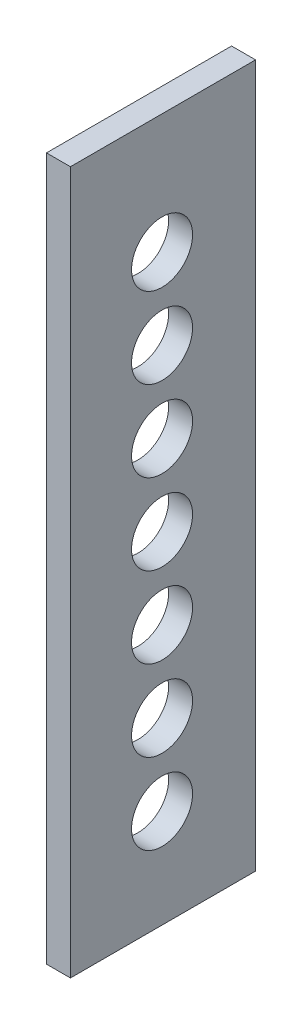
ISO-10303-21;
HEADER;
FILE_DESCRIPTION(('STEP AP214'),'2;1');
FILE_NAME('part.step','',(''),(''),'','','');
FILE_SCHEMA(('AUTOMOTIVE_DESIGN { 1 0 10303 214 1 1 1 1 }'));
ENDSEC;
DATA;
#1=APPLICATION_CONTEXT('core data for automotive mechanical design processes');
#2=APPLICATION_PROTOCOL_DEFINITION('international standard','automotive_design',2000,#1);
#3=PRODUCT_CONTEXT('',#1,'mechanical');
#4=PRODUCT('Part','Part','',(#3));
#5=PRODUCT_RELATED_PRODUCT_CATEGORY('part','',(#4));
#6=PRODUCT_DEFINITION_FORMATION('','',#4);
#7=PRODUCT_DEFINITION_CONTEXT('part definition',#1,'design');
#8=PRODUCT_DEFINITION('design','',#6,#7);
#9=PRODUCT_DEFINITION_SHAPE('','',#8);
#10=(LENGTH_UNIT() NAMED_UNIT(*) SI_UNIT(.MILLI.,.METRE.));
#11=(NAMED_UNIT(*) PLANE_ANGLE_UNIT() SI_UNIT($,.RADIAN.));
#12=(NAMED_UNIT(*) SI_UNIT($,.STERADIAN.) SOLID_ANGLE_UNIT());
#13=UNCERTAINTY_MEASURE_WITH_UNIT(LENGTH_MEASURE(1.E-05),#10,'distance_accuracy_value','');
#14=(GEOMETRIC_REPRESENTATION_CONTEXT(3) GLOBAL_UNCERTAINTY_ASSIGNED_CONTEXT((#13)) GLOBAL_UNIT_ASSIGNED_CONTEXT((#10,
#11,#12)) REPRESENTATION_CONTEXT('',''));
#15=CARTESIAN_POINT('',(0.,0.,0.));
#16=DIRECTION('',(0.,0.,1.));
#17=DIRECTION('',(1.,0.,0.));
#18=AXIS2_PLACEMENT_3D('',#15,#16,#17);
#19=CARTESIAN_POINT('',(5.5,-161.164904788649,-8.64690263835399E-11));
#20=DIRECTION('',(1.,0.,0.));
#21=DIRECTION('',(0.,0.,-1.));
#22=AXIS2_PLACEMENT_3D('',#19,#20,#21);
#23=PLANE('',#22);
#24=CARTESIAN_POINT('',(5.5,-120.033955517333,-21.0159809053521));
#25=DIRECTION('',(1.,0.,0.));
#26=DIRECTION('',(0.,0.,-1.));
#27=AXIS2_PLACEMENT_3D('',#24,#25,#26);
#28=CIRCLE('',#27,7.);
#29=CARTESIAN_POINT('',(5.5,-120.033955517333,-28.0159809053521));
#30=VERTEX_POINT('',#29);
#31=EDGE_CURVE('E137',#30,#30,#28,.T.);
#32=ORIENTED_EDGE('',*,*,#31,.F.);
#33=EDGE_LOOP('',(#32));
#34=FACE_BOUND('',#33,.T.);
#35=CARTESIAN_POINT('',(5.5,-83.0076355725733,-21.0159809053517));
#36=DIRECTION('',(1.,0.,0.));
#37=DIRECTION('',(0.,0.,-1.));
#38=AXIS2_PLACEMENT_3D('',#35,#36,#37);
#39=CIRCLE('',#38,7.);
#40=CARTESIAN_POINT('',(5.5,-83.0076355725733,-28.0159809053517));
#41=VERTEX_POINT('',#40);
#42=EDGE_CURVE('E125',#41,#41,#39,.T.);
#43=ORIENTED_EDGE('',*,*,#42,.F.);
#44=EDGE_LOOP('',(#43));
#45=FACE_BOUND('',#44,.T.);
#46=CARTESIAN_POINT('',(5.5,-45.9813156278136,-21.0159809053513));
#47=DIRECTION('',(1.,0.,0.));
#48=DIRECTION('',(0.,0.,-1.));
#49=AXIS2_PLACEMENT_3D('',#46,#47,#48);
#50=CIRCLE('',#49,7.);
#51=CARTESIAN_POINT('',(5.5,-45.9813156278136,-28.0159809053513));
#52=VERTEX_POINT('',#51);
#53=EDGE_CURVE('E113',#52,#52,#50,.T.);
#54=ORIENTED_EDGE('',*,*,#53,.F.);
#55=EDGE_LOOP('',(#54));
#56=FACE_BOUND('',#55,.T.);
#57=DIRECTION('',(0.,-1.,0.));
#58=VECTOR('',#57,1.);
#59=CARTESIAN_POINT('',(5.5,0.,-8.64492893750615E-11));
#60=LINE('',#59,#58);
#61=CARTESIAN_POINT('',(5.5,0.,-8.64492893750615E-11));
#62=VERTEX_POINT('',#61);
#63=CARTESIAN_POINT('',(5.5,-161.164904788649,-8.64690263835399E-11));
#64=VERTEX_POINT('',#63);
#65=EDGE_CURVE('E83',#62,#64,#60,.T.);
#66=ORIENTED_EDGE('',*,*,#65,.T.);
#67=DIRECTION('',(0.,0.,-1.));
#68=VECTOR('',#67,1.);
#69=CARTESIAN_POINT('',(5.5,-161.164904788649,-8.64690263835399E-11));
#70=LINE('',#69,#68);
#71=CARTESIAN_POINT('',(5.5,-161.164904788649,-42.4617451466736));
#72=VERTEX_POINT('',#71);
#73=EDGE_CURVE('E78',#64,#72,#70,.T.);
#74=ORIENTED_EDGE('',*,*,#73,.T.);
#75=DIRECTION('',(0.,1.,0.));
#76=VECTOR('',#75,1.);
#77=CARTESIAN_POINT('',(5.5,0.,-42.4617451466735));
#78=LINE('',#77,#76);
#79=CARTESIAN_POINT('',(5.5,0.,-42.4617451466735));
#80=VERTEX_POINT('',#79);
#81=EDGE_CURVE('E81',#72,#80,#78,.T.);
#82=ORIENTED_EDGE('',*,*,#81,.T.);
#83=DIRECTION('',(0.,0.,1.));
#84=VECTOR('',#83,1.);
#85=CARTESIAN_POINT('',(5.5,0.,-8.64492893750615E-11));
#86=LINE('',#85,#84);
#87=EDGE_CURVE('E48',#80,#62,#86,.T.);
#88=ORIENTED_EDGE('',*,*,#87,.T.);
#89=EDGE_LOOP('',(#66,#74,#82,#88));
#90=FACE_BOUND('',#89,.T.);
#91=CARTESIAN_POINT('',(5.5,-27.4681556554338,-21.0159809053511));
#92=DIRECTION('',(1.,0.,0.));
#93=DIRECTION('',(0.,0.,-1.));
#94=AXIS2_PLACEMENT_3D('',#91,#92,#93);
#95=CIRCLE('',#94,7.);
#96=CARTESIAN_POINT('',(5.5,-27.4681556554338,-28.0159809053511));
#97=VERTEX_POINT('',#96);
#98=EDGE_CURVE('E98',#97,#97,#95,.T.);
#99=ORIENTED_EDGE('',*,*,#98,.F.);
#100=EDGE_LOOP('',(#99));
#101=FACE_BOUND('',#100,.T.);
#102=CARTESIAN_POINT('',(5.5,-64.4944756001935,-21.0159809053515));
#103=DIRECTION('',(1.,0.,0.));
#104=DIRECTION('',(0.,0.,-1.));
#105=AXIS2_PLACEMENT_3D('',#102,#103,#104);
#106=CIRCLE('',#105,7.);
#107=CARTESIAN_POINT('',(5.5,-64.4944756001935,-28.0159809053515));
#108=VERTEX_POINT('',#107);
#109=EDGE_CURVE('E119',#108,#108,#106,.T.);
#110=ORIENTED_EDGE('',*,*,#109,.F.);
#111=EDGE_LOOP('',(#110));
#112=FACE_BOUND('',#111,.T.);
#113=CARTESIAN_POINT('',(5.5,-101.520795544953,-21.0159809053519));
#114=DIRECTION('',(1.,0.,0.));
#115=DIRECTION('',(0.,0.,-1.));
#116=AXIS2_PLACEMENT_3D('',#113,#114,#115);
#117=CIRCLE('',#116,7.);
#118=CARTESIAN_POINT('',(5.5,-101.520795544953,-28.0159809053519));
#119=VERTEX_POINT('',#118);
#120=EDGE_CURVE('E131',#119,#119,#117,.T.);
#121=ORIENTED_EDGE('',*,*,#120,.F.);
#122=EDGE_LOOP('',(#121));
#123=FACE_BOUND('',#122,.T.);
#124=CARTESIAN_POINT('',(5.5,-138.547115489713,-21.0159809053523));
#125=DIRECTION('',(1.,0.,0.));
#126=DIRECTION('',(0.,0.,-1.));
#127=AXIS2_PLACEMENT_3D('',#124,#125,#126);
#128=CIRCLE('',#127,7.);
#129=CARTESIAN_POINT('',(5.5,-138.547115489713,-28.0159809053523));
#130=VERTEX_POINT('',#129);
#131=EDGE_CURVE('E143',#130,#130,#128,.T.);
#132=ORIENTED_EDGE('',*,*,#131,.F.);
#133=EDGE_LOOP('',(#132));
#134=FACE_BOUND('',#133,.T.);
#135=ADVANCED_FACE('F31',(#34,#45,#56,#90,#101,#112,#123,#134),#23,.T.);
#136=CARTESIAN_POINT('',(0.,-161.164904788649,-8.64690263835399E-11));
#137=DIRECTION('',(1.,0.,0.));
#138=DIRECTION('',(0.,0.,-1.));
#139=AXIS2_PLACEMENT_3D('',#136,#137,#138);
#140=PLANE('',#139);
#141=CARTESIAN_POINT('',(0.,-120.033955517333,-21.0159809053521));
#142=DIRECTION('',(1.,0.,0.));
#143=DIRECTION('',(0.,0.,-1.));
#144=AXIS2_PLACEMENT_3D('',#141,#142,#143);
#145=CIRCLE('',#144,7.);
#146=CARTESIAN_POINT('',(0.,-120.033955517333,-28.0159809053521));
#147=VERTEX_POINT('',#146);
#148=EDGE_CURVE('E140',#147,#147,#145,.T.);
#149=ORIENTED_EDGE('',*,*,#148,.T.);
#150=EDGE_LOOP('',(#149));
#151=FACE_BOUND('',#150,.T.);
#152=CARTESIAN_POINT('',(0.,-83.0076355725733,-21.0159809053517));
#153=DIRECTION('',(1.,0.,0.));
#154=DIRECTION('',(0.,0.,-1.));
#155=AXIS2_PLACEMENT_3D('',#152,#153,#154);
#156=CIRCLE('',#155,7.);
#157=CARTESIAN_POINT('',(0.,-83.0076355725733,-28.0159809053517));
#158=VERTEX_POINT('',#157);
#159=EDGE_CURVE('E128',#158,#158,#156,.T.);
#160=ORIENTED_EDGE('',*,*,#159,.T.);
#161=EDGE_LOOP('',(#160));
#162=FACE_BOUND('',#161,.T.);
#163=CARTESIAN_POINT('',(0.,-45.9813156278136,-21.0159809053513));
#164=DIRECTION('',(1.,0.,0.));
#165=DIRECTION('',(0.,0.,-1.));
#166=AXIS2_PLACEMENT_3D('',#163,#164,#165);
#167=CIRCLE('',#166,7.);
#168=CARTESIAN_POINT('',(0.,-45.9813156278136,-28.0159809053513));
#169=VERTEX_POINT('',#168);
#170=EDGE_CURVE('E116',#169,#169,#167,.T.);
#171=ORIENTED_EDGE('',*,*,#170,.T.);
#172=EDGE_LOOP('',(#171));
#173=FACE_BOUND('',#172,.T.);
#174=DIRECTION('',(0.,-1.,0.));
#175=VECTOR('',#174,1.);
#176=CARTESIAN_POINT('',(0.,0.,-8.64492893750615E-11));
#177=LINE('',#176,#175);
#178=CARTESIAN_POINT('',(0.,0.,-8.64492893750615E-11));
#179=VERTEX_POINT('',#178);
#180=CARTESIAN_POINT('',(0.,-161.164904788649,-8.64690263835399E-11));
#181=VERTEX_POINT('',#180);
#182=EDGE_CURVE('E95',#179,#181,#177,.T.);
#183=ORIENTED_EDGE('',*,*,#182,.F.);
#184=DIRECTION('',(0.,0.,1.));
#185=VECTOR('',#184,1.);
#186=CARTESIAN_POINT('',(0.,0.,-8.64492893750615E-11));
#187=LINE('',#186,#185);
#188=CARTESIAN_POINT('',(0.,0.,-42.4617451466735));
#189=VERTEX_POINT('',#188);
#190=EDGE_CURVE('E71',#189,#179,#187,.T.);
#191=ORIENTED_EDGE('',*,*,#190,.F.);
#192=DIRECTION('',(0.,1.,0.));
#193=VECTOR('',#192,1.);
#194=CARTESIAN_POINT('',(0.,0.,-42.4617451466735));
#195=LINE('',#194,#193);
#196=CARTESIAN_POINT('',(0.,-161.164904788649,-42.4617451466736));
#197=VERTEX_POINT('',#196);
#198=EDGE_CURVE('E65',#197,#189,#195,.T.);
#199=ORIENTED_EDGE('',*,*,#198,.F.);
#200=DIRECTION('',(0.,0.,-1.));
#201=VECTOR('',#200,1.);
#202=CARTESIAN_POINT('',(0.,-161.164904788649,-8.64690263835399E-11));
#203=LINE('',#202,#201);
#204=EDGE_CURVE('E87',#181,#197,#203,.T.);
#205=ORIENTED_EDGE('',*,*,#204,.F.);
#206=EDGE_LOOP('',(#183,#191,#199,#205));
#207=FACE_BOUND('',#206,.T.);
#208=CARTESIAN_POINT('',(0.,-27.4681556554338,-21.0159809053511));
#209=DIRECTION('',(1.,0.,0.));
#210=DIRECTION('',(0.,0.,-1.));
#211=AXIS2_PLACEMENT_3D('',#208,#209,#210);
#212=CIRCLE('',#211,7.);
#213=CARTESIAN_POINT('',(0.,-27.4681556554338,-28.0159809053511));
#214=VERTEX_POINT('',#213);
#215=EDGE_CURVE('E110',#214,#214,#212,.T.);
#216=ORIENTED_EDGE('',*,*,#215,.T.);
#217=EDGE_LOOP('',(#216));
#218=FACE_BOUND('',#217,.T.);
#219=CARTESIAN_POINT('',(0.,-64.4944756001935,-21.0159809053515));
#220=DIRECTION('',(1.,0.,0.));
#221=DIRECTION('',(0.,0.,-1.));
#222=AXIS2_PLACEMENT_3D('',#219,#220,#221);
#223=CIRCLE('',#222,7.);
#224=CARTESIAN_POINT('',(0.,-64.4944756001935,-28.0159809053515));
#225=VERTEX_POINT('',#224);
#226=EDGE_CURVE('E122',#225,#225,#223,.T.);
#227=ORIENTED_EDGE('',*,*,#226,.T.);
#228=EDGE_LOOP('',(#227));
#229=FACE_BOUND('',#228,.T.);
#230=CARTESIAN_POINT('',(0.,-101.520795544953,-21.0159809053519));
#231=DIRECTION('',(1.,0.,0.));
#232=DIRECTION('',(0.,0.,-1.));
#233=AXIS2_PLACEMENT_3D('',#230,#231,#232);
#234=CIRCLE('',#233,7.);
#235=CARTESIAN_POINT('',(0.,-101.520795544953,-28.0159809053519));
#236=VERTEX_POINT('',#235);
#237=EDGE_CURVE('E134',#236,#236,#234,.T.);
#238=ORIENTED_EDGE('',*,*,#237,.T.);
#239=EDGE_LOOP('',(#238));
#240=FACE_BOUND('',#239,.T.);
#241=CARTESIAN_POINT('',(0.,-138.547115489713,-21.0159809053523));
#242=DIRECTION('',(1.,0.,0.));
#243=DIRECTION('',(0.,0.,-1.));
#244=AXIS2_PLACEMENT_3D('',#241,#242,#243);
#245=CIRCLE('',#244,7.);
#246=CARTESIAN_POINT('',(0.,-138.547115489713,-28.0159809053523));
#247=VERTEX_POINT('',#246);
#248=EDGE_CURVE('E146',#247,#247,#245,.T.);
#249=ORIENTED_EDGE('',*,*,#248,.T.);
#250=EDGE_LOOP('',(#249));
#251=FACE_BOUND('',#250,.T.);
#252=ADVANCED_FACE('F106',(#151,#162,#173,#207,#218,#229,#240,#251),#140,.F.);
#253=CARTESIAN_POINT('',(5.5,0.,-8.64492893750615E-11));
#254=DIRECTION('',(0.,0.,-1.));
#255=DIRECTION('',(0.,1.,0.));
#256=AXIS2_PLACEMENT_3D('',#253,#254,#255);
#257=PLANE('',#256);
#258=ORIENTED_EDGE('',*,*,#182,.T.);
#259=DIRECTION('',(-1.,0.,0.));
#260=VECTOR('',#259,1.);
#261=CARTESIAN_POINT('',(5.5,-161.164904788649,-8.64690263835399E-11));
#262=LINE('',#261,#260);
#263=EDGE_CURVE('E11',#64,#181,#262,.T.);
#264=ORIENTED_EDGE('',*,*,#263,.F.);
#265=ORIENTED_EDGE('',*,*,#65,.F.);
#266=DIRECTION('',(-1.,0.,0.));
#267=VECTOR('',#266,1.);
#268=CARTESIAN_POINT('',(5.5,0.,-8.64492893750615E-11));
#269=LINE('',#268,#267);
#270=EDGE_CURVE('E91',#62,#179,#269,.T.);
#271=ORIENTED_EDGE('',*,*,#270,.T.);
#272=EDGE_LOOP('',(#258,#264,#265,#271));
#273=FACE_BOUND('',#272,.T.);
#274=ADVANCED_FACE('F33',(#273),#257,.F.);
#275=CARTESIAN_POINT('',(5.5,-161.164904788649,-8.64690263835399E-11));
#276=DIRECTION('',(0.,1.,0.));
#277=DIRECTION('',(0.,0.,1.));
#278=AXIS2_PLACEMENT_3D('',#275,#276,#277);
#279=PLANE('',#278);
#280=ORIENTED_EDGE('',*,*,#204,.T.);
#281=DIRECTION('',(-1.,0.,0.));
#282=VECTOR('',#281,1.);
#283=CARTESIAN_POINT('',(5.5,-161.164904788649,-42.4617451466736));
#284=LINE('',#283,#282);
#285=EDGE_CURVE('E40',#72,#197,#284,.T.);
#286=ORIENTED_EDGE('',*,*,#285,.F.);
#287=ORIENTED_EDGE('',*,*,#73,.F.);
#288=ORIENTED_EDGE('',*,*,#263,.T.);
#289=EDGE_LOOP('',(#280,#286,#287,#288));
#290=FACE_BOUND('',#289,.T.);
#291=ADVANCED_FACE('F86',(#290),#279,.F.);
#292=CARTESIAN_POINT('',(5.5,0.,-42.4617451466735));
#293=DIRECTION('',(0.,0.,1.));
#294=DIRECTION('',(0.,-1.,0.));
#295=AXIS2_PLACEMENT_3D('',#292,#293,#294);
#296=PLANE('',#295);
#297=ORIENTED_EDGE('',*,*,#198,.T.);
#298=DIRECTION('',(-1.,0.,0.));
#299=VECTOR('',#298,1.);
#300=CARTESIAN_POINT('',(5.5,0.,-42.4617451466735));
#301=LINE('',#300,#299);
#302=EDGE_CURVE('E88',#80,#189,#301,.T.);
#303=ORIENTED_EDGE('',*,*,#302,.F.);
#304=ORIENTED_EDGE('',*,*,#81,.F.);
#305=ORIENTED_EDGE('',*,*,#285,.T.);
#306=EDGE_LOOP('',(#297,#303,#304,#305));
#307=FACE_BOUND('',#306,.T.);
#308=ADVANCED_FACE('F89',(#307),#296,.F.);
#309=CARTESIAN_POINT('',(5.5,0.,-8.64492893750615E-11));
#310=DIRECTION('',(0.,-1.,0.));
#311=DIRECTION('',(0.,0.,-1.));
#312=AXIS2_PLACEMENT_3D('',#309,#310,#311);
#313=PLANE('',#312);
#314=ORIENTED_EDGE('',*,*,#190,.T.);
#315=ORIENTED_EDGE('',*,*,#270,.F.);
#316=ORIENTED_EDGE('',*,*,#87,.F.);
#317=ORIENTED_EDGE('',*,*,#302,.T.);
#318=EDGE_LOOP('',(#314,#315,#316,#317));
#319=FACE_BOUND('',#318,.T.);
#320=ADVANCED_FACE('F103',(#319),#313,.F.);
#321=CARTESIAN_POINT('',(5.5,-27.4681556554338,-21.0159809053511));
#322=DIRECTION('',(-1.,0.,0.));
#323=DIRECTION('',(0.,0.,1.));
#324=AXIS2_PLACEMENT_3D('',#321,#322,#323);
#325=CYLINDRICAL_SURFACE('',#324,7.);
#326=ORIENTED_EDGE('',*,*,#98,.T.);
#327=EDGE_LOOP('',(#326));
#328=FACE_BOUND('',#327,.T.);
#329=ORIENTED_EDGE('',*,*,#215,.F.);
#330=EDGE_LOOP('',(#329));
#331=FACE_BOUND('',#330,.T.);
#332=ADVANCED_FACE('F166',(#328,#331),#325,.F.);
#333=CARTESIAN_POINT('',(5.5,-45.9813156278136,-21.0159809053513));
#334=DIRECTION('',(-1.,0.,0.));
#335=DIRECTION('',(0.,0.,1.));
#336=AXIS2_PLACEMENT_3D('',#333,#334,#335);
#337=CYLINDRICAL_SURFACE('',#336,7.);
#338=ORIENTED_EDGE('',*,*,#53,.T.);
#339=EDGE_LOOP('',(#338));
#340=FACE_BOUND('',#339,.T.);
#341=ORIENTED_EDGE('',*,*,#170,.F.);
#342=EDGE_LOOP('',(#341));
#343=FACE_BOUND('',#342,.T.);
#344=ADVANCED_FACE('F212',(#340,#343),#337,.F.);
#345=CARTESIAN_POINT('',(5.5,-64.4944756001935,-21.0159809053515));
#346=DIRECTION('',(-1.,0.,0.));
#347=DIRECTION('',(0.,0.,1.));
#348=AXIS2_PLACEMENT_3D('',#345,#346,#347);
#349=CYLINDRICAL_SURFACE('',#348,7.);
#350=ORIENTED_EDGE('',*,*,#109,.T.);
#351=EDGE_LOOP('',(#350));
#352=FACE_BOUND('',#351,.T.);
#353=ORIENTED_EDGE('',*,*,#226,.F.);
#354=EDGE_LOOP('',(#353));
#355=FACE_BOUND('',#354,.T.);
#356=ADVANCED_FACE('F220',(#352,#355),#349,.F.);
#357=CARTESIAN_POINT('',(5.5,-83.0076355725733,-21.0159809053517));
#358=DIRECTION('',(-1.,0.,0.));
#359=DIRECTION('',(0.,0.,1.));
#360=AXIS2_PLACEMENT_3D('',#357,#358,#359);
#361=CYLINDRICAL_SURFACE('',#360,7.);
#362=ORIENTED_EDGE('',*,*,#42,.T.);
#363=EDGE_LOOP('',(#362));
#364=FACE_BOUND('',#363,.T.);
#365=ORIENTED_EDGE('',*,*,#159,.F.);
#366=EDGE_LOOP('',(#365));
#367=FACE_BOUND('',#366,.T.);
#368=ADVANCED_FACE('F228',(#364,#367),#361,.F.);
#369=CARTESIAN_POINT('',(5.5,-101.520795544953,-21.0159809053519));
#370=DIRECTION('',(-1.,0.,0.));
#371=DIRECTION('',(0.,0.,1.));
#372=AXIS2_PLACEMENT_3D('',#369,#370,#371);
#373=CYLINDRICAL_SURFACE('',#372,7.);
#374=ORIENTED_EDGE('',*,*,#120,.T.);
#375=EDGE_LOOP('',(#374));
#376=FACE_BOUND('',#375,.T.);
#377=ORIENTED_EDGE('',*,*,#237,.F.);
#378=EDGE_LOOP('',(#377));
#379=FACE_BOUND('',#378,.T.);
#380=ADVANCED_FACE('F237',(#376,#379),#373,.F.);
#381=CARTESIAN_POINT('',(5.5,-120.033955517333,-21.0159809053521));
#382=DIRECTION('',(-1.,0.,0.));
#383=DIRECTION('',(0.,0.,1.));
#384=AXIS2_PLACEMENT_3D('',#381,#382,#383);
#385=CYLINDRICAL_SURFACE('',#384,7.);
#386=ORIENTED_EDGE('',*,*,#31,.T.);
#387=EDGE_LOOP('',(#386));
#388=FACE_BOUND('',#387,.T.);
#389=ORIENTED_EDGE('',*,*,#148,.F.);
#390=EDGE_LOOP('',(#389));
#391=FACE_BOUND('',#390,.T.);
#392=ADVANCED_FACE('F246',(#388,#391),#385,.F.);
#393=CARTESIAN_POINT('',(5.5,-138.547115489713,-21.0159809053523));
#394=DIRECTION('',(-1.,0.,0.));
#395=DIRECTION('',(0.,0.,1.));
#396=AXIS2_PLACEMENT_3D('',#393,#394,#395);
#397=CYLINDRICAL_SURFACE('',#396,7.);
#398=ORIENTED_EDGE('',*,*,#131,.T.);
#399=EDGE_LOOP('',(#398));
#400=FACE_BOUND('',#399,.T.);
#401=ORIENTED_EDGE('',*,*,#248,.F.);
#402=EDGE_LOOP('',(#401));
#403=FACE_BOUND('',#402,.T.);
#404=ADVANCED_FACE('F152',(#400,#403),#397,.F.);
#405=CLOSED_SHELL('',(#135,#252,#274,#291,#308,#320,#332,#344,#356,#368,#380,#392,#404));
#406=MANIFOLD_SOLID_BREP('B2',#405);
#407=ADVANCED_BREP_SHAPE_REPRESENTATION('',(#18,#406),#14);
#408=SHAPE_DEFINITION_REPRESENTATION(#9,#407);
ENDSEC;
END-ISO-10303-21;
